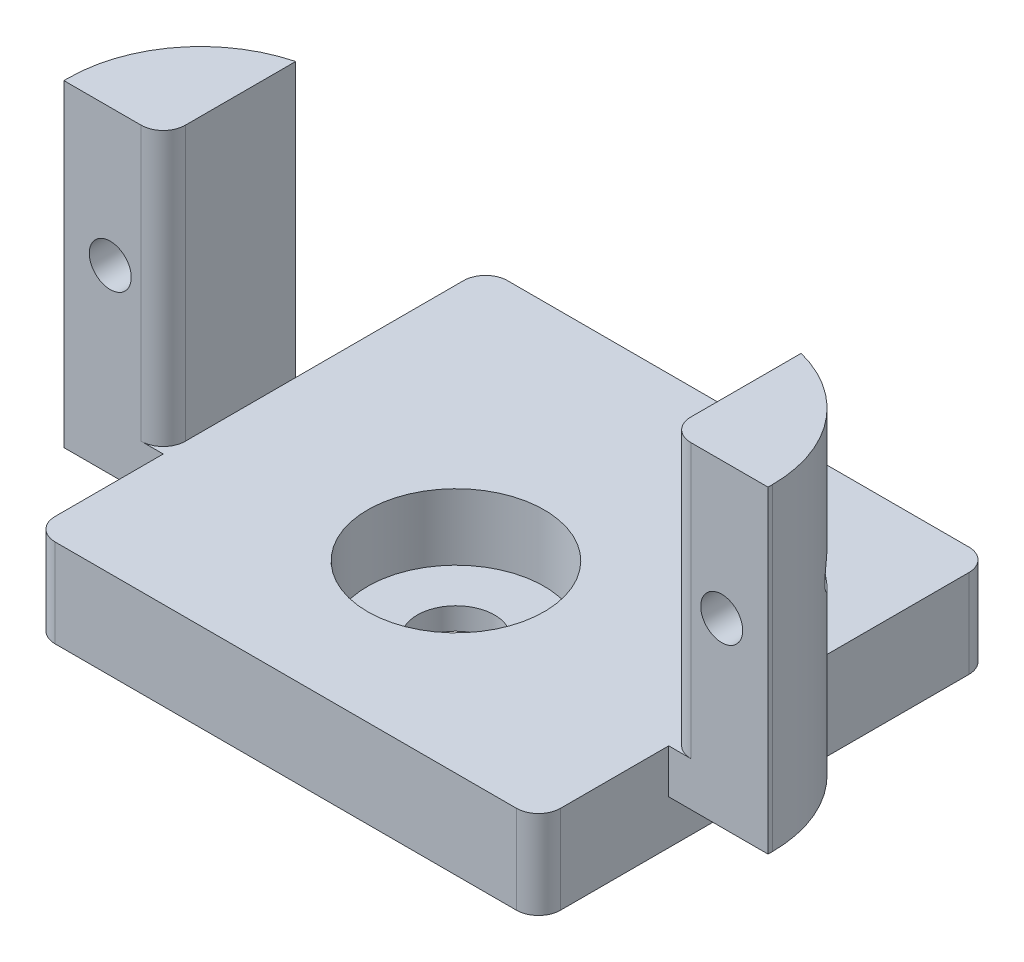
ISO-10303-21;
HEADER;
FILE_DESCRIPTION(('STEP AP214'),'2;1');
FILE_NAME('part.step','',(''),(''),'','','');
FILE_SCHEMA(('AUTOMOTIVE_DESIGN { 1 0 10303 214 1 1 1 1 }'));
ENDSEC;
DATA;
#1=APPLICATION_CONTEXT('core data for automotive mechanical design processes');
#2=APPLICATION_PROTOCOL_DEFINITION('international standard','automotive_design',2000,#1);
#3=PRODUCT_CONTEXT('',#1,'mechanical');
#4=PRODUCT('Part','Part','',(#3));
#5=PRODUCT_RELATED_PRODUCT_CATEGORY('part','',(#4));
#6=PRODUCT_DEFINITION_FORMATION('','',#4);
#7=PRODUCT_DEFINITION_CONTEXT('part definition',#1,'design');
#8=PRODUCT_DEFINITION('design','',#6,#7);
#9=PRODUCT_DEFINITION_SHAPE('','',#8);
#10=(LENGTH_UNIT() NAMED_UNIT(*) SI_UNIT(.MILLI.,.METRE.));
#11=(NAMED_UNIT(*) PLANE_ANGLE_UNIT() SI_UNIT($,.RADIAN.));
#12=(NAMED_UNIT(*) SI_UNIT($,.STERADIAN.) SOLID_ANGLE_UNIT());
#13=UNCERTAINTY_MEASURE_WITH_UNIT(LENGTH_MEASURE(1.E-05),#10,'distance_accuracy_value','');
#14=(GEOMETRIC_REPRESENTATION_CONTEXT(3) GLOBAL_UNCERTAINTY_ASSIGNED_CONTEXT((#13)) GLOBAL_UNIT_ASSIGNED_CONTEXT((#10,
#11,#12)) REPRESENTATION_CONTEXT('',''));
#15=CARTESIAN_POINT('',(0.,0.,0.));
#16=DIRECTION('',(0.,0.,1.));
#17=DIRECTION('',(1.,0.,0.));
#18=AXIS2_PLACEMENT_3D('',#15,#16,#17);
#19=CARTESIAN_POINT('',(0.,0.,0.));
#20=DIRECTION('',(0.,1.,0.));
#21=DIRECTION('',(0.,0.,1.));
#22=AXIS2_PLACEMENT_3D('',#19,#20,#21);
#23=PLANE('',#22);
#24=DIRECTION('',(0.,0.,1.));
#25=VECTOR('',#24,1.);
#26=CARTESIAN_POINT('',(-15.95,0.,4.1));
#27=LINE('',#26,#25);
#28=CARTESIAN_POINT('',(-15.95,0.,3.90947501931113));
#29=VERTEX_POINT('',#28);
#30=CARTESIAN_POINT('',(-15.95,0.,4.1));
#31=VERTEX_POINT('',#30);
#32=EDGE_CURVE('E185',#29,#31,#27,.T.);
#33=ORIENTED_EDGE('',*,*,#32,.F.);
#34=CARTESIAN_POINT('',(-9.95,0.,3.90947501931113));
#35=DIRECTION('',(0.,1.,0.));
#36=DIRECTION('',(0.,0.,1.));
#37=AXIS2_PLACEMENT_3D('',#34,#35,#36);
#38=CIRCLE('',#37,6.);
#39=CARTESIAN_POINT('',(-11.45,0.,-1.9));
#40=VERTEX_POINT('',#39);
#41=EDGE_CURVE('E48',#29,#40,#38,.F.);
#42=ORIENTED_EDGE('',*,*,#41,.T.);
#43=DIRECTION('',(0.,0.,1.));
#44=VECTOR('',#43,1.);
#45=CARTESIAN_POINT('',(-11.45,0.,-10.5));
#46=LINE('',#45,#44);
#47=CARTESIAN_POINT('',(-11.45,0.,4.1));
#48=VERTEX_POINT('',#47);
#49=EDGE_CURVE('E183',#40,#48,#46,.T.);
#50=ORIENTED_EDGE('',*,*,#49,.T.);
#51=DIRECTION('',(1.,0.,0.));
#52=VECTOR('',#51,1.);
#53=CARTESIAN_POINT('',(-11.45,0.,4.1));
#54=LINE('',#53,#52);
#55=EDGE_CURVE('E228',#31,#48,#54,.T.);
#56=ORIENTED_EDGE('',*,*,#55,.F.);
#57=EDGE_LOOP('',(#33,#42,#50,#56));
#58=FACE_BOUND('',#57,.T.);
#59=ADVANCED_FACE('F34',(#58),#23,.F.);
#60=CARTESIAN_POINT('',(11.45,2.,-10.5));
#61=DIRECTION('',(0.,0.,1.));
#62=DIRECTION('',(1.,0.,0.));
#63=AXIS2_PLACEMENT_3D('',#60,#61,#62);
#64=PLANE('',#63);
#65=DIRECTION('',(-1.,0.,0.));
#66=VECTOR('',#65,1.);
#67=CARTESIAN_POINT('',(11.45,2.,-10.5));
#68=LINE('',#67,#66);
#69=CARTESIAN_POINT('',(10.45,2.,-10.5));
#70=VERTEX_POINT('',#69);
#71=CARTESIAN_POINT('',(-10.45,2.,-10.5));
#72=VERTEX_POINT('',#71);
#73=EDGE_CURVE('E215',#70,#72,#68,.T.);
#74=ORIENTED_EDGE('',*,*,#73,.F.);
#75=DIRECTION('',(0.,-1.,0.));
#76=VECTOR('',#75,1.);
#77=CARTESIAN_POINT('',(10.45,2.,-10.5));
#78=LINE('',#77,#76);
#79=CARTESIAN_POINT('',(10.45,-2.,-10.5));
#80=VERTEX_POINT('',#79);
#81=EDGE_CURVE('E700',#70,#80,#78,.T.);
#82=ORIENTED_EDGE('',*,*,#81,.T.);
#83=DIRECTION('',(-1.,0.,0.));
#84=VECTOR('',#83,1.);
#85=CARTESIAN_POINT('',(11.45,-2.,-10.5));
#86=LINE('',#85,#84);
#87=CARTESIAN_POINT('',(-10.45,-2.,-10.5));
#88=VERTEX_POINT('',#87);
#89=EDGE_CURVE('E270',#80,#88,#86,.T.);
#90=ORIENTED_EDGE('',*,*,#89,.T.);
#91=DIRECTION('',(0.,-1.,0.));
#92=VECTOR('',#91,1.);
#93=CARTESIAN_POINT('',(-10.45,2.,-10.5));
#94=LINE('',#93,#92);
#95=EDGE_CURVE('E199',#88,#72,#94,.F.);
#96=ORIENTED_EDGE('',*,*,#95,.T.);
#97=EDGE_LOOP('',(#74,#82,#90,#96));
#98=FACE_BOUND('',#97,.T.);
#99=ADVANCED_FACE('F359',(#98),#64,.F.);
#100=CARTESIAN_POINT('',(-11.45,2.,-10.5));
#101=DIRECTION('',(1.,0.,0.));
#102=DIRECTION('',(0.,0.,-1.));
#103=AXIS2_PLACEMENT_3D('',#100,#101,#102);
#104=PLANE('',#103);
#105=DIRECTION('',(0.,0.,1.));
#106=VECTOR('',#105,1.);
#107=CARTESIAN_POINT('',(-11.45,-2.,-10.5));
#108=LINE('',#107,#106);
#109=CARTESIAN_POINT('',(-11.45,-2.,-9.5));
#110=VERTEX_POINT('',#109);
#111=CARTESIAN_POINT('',(-11.45,-2.,9.));
#112=VERTEX_POINT('',#111);
#113=EDGE_CURVE('E268',#110,#112,#108,.T.);
#114=ORIENTED_EDGE('',*,*,#113,.T.);
#115=DIRECTION('',(0.,1.,0.));
#116=VECTOR('',#115,1.);
#117=CARTESIAN_POINT('',(-11.45,2.,9.));
#118=LINE('',#117,#116);
#119=CARTESIAN_POINT('',(-11.45,2.,9.));
#120=VERTEX_POINT('',#119);
#121=EDGE_CURVE('E305',#112,#120,#118,.T.);
#122=ORIENTED_EDGE('',*,*,#121,.T.);
#123=DIRECTION('',(0.,0.,1.));
#124=VECTOR('',#123,1.);
#125=CARTESIAN_POINT('',(-11.45,2.,-10.5));
#126=LINE('',#125,#124);
#127=CARTESIAN_POINT('',(-11.45,2.,4.1));
#128=VERTEX_POINT('',#127);
#129=EDGE_CURVE('E218',#128,#120,#126,.T.);
#130=ORIENTED_EDGE('',*,*,#129,.F.);
#131=DIRECTION('',(0.,-1.,0.));
#132=VECTOR('',#131,1.);
#133=CARTESIAN_POINT('',(-11.45,14.4,4.1));
#134=LINE('',#133,#132);
#135=EDGE_CURVE('E198',#128,#48,#134,.T.);
#136=ORIENTED_EDGE('',*,*,#135,.T.);
#137=ORIENTED_EDGE('',*,*,#49,.F.);
#138=DIRECTION('',(0.,-1.,0.));
#139=VECTOR('',#138,1.);
#140=CARTESIAN_POINT('',(-11.45,14.4,-1.9));
#141=LINE('',#140,#139);
#142=CARTESIAN_POINT('',(-11.45,2.,-1.9));
#143=VERTEX_POINT('',#142);
#144=EDGE_CURVE('E194',#143,#40,#141,.T.);
#145=ORIENTED_EDGE('',*,*,#144,.F.);
#146=CARTESIAN_POINT('',(-11.45,2.,-9.5));
#147=VERTEX_POINT('',#146);
#148=EDGE_CURVE('E642',#147,#143,#126,.T.);
#149=ORIENTED_EDGE('',*,*,#148,.F.);
#150=DIRECTION('',(0.,-1.,0.));
#151=VECTOR('',#150,1.);
#152=CARTESIAN_POINT('',(-11.45,2.,-9.5));
#153=LINE('',#152,#151);
#154=EDGE_CURVE('E690',#147,#110,#153,.T.);
#155=ORIENTED_EDGE('',*,*,#154,.T.);
#156=EDGE_LOOP('',(#114,#122,#130,#136,#137,#145,#149,#155));
#157=FACE_BOUND('',#156,.T.);
#158=ADVANCED_FACE('F192',(#157),#104,.F.);
#159=CARTESIAN_POINT('',(11.45,2.,-10.5));
#160=DIRECTION('',(-1.,0.,0.));
#161=DIRECTION('',(0.,0.,1.));
#162=AXIS2_PLACEMENT_3D('',#159,#160,#161);
#163=PLANE('',#162);
#164=DIRECTION('',(0.,0.,-1.));
#165=VECTOR('',#164,1.);
#166=CARTESIAN_POINT('',(11.45,2.,-10.5));
#167=LINE('',#166,#165);
#168=CARTESIAN_POINT('',(11.45,2.,9.));
#169=VERTEX_POINT('',#168);
#170=CARTESIAN_POINT('',(11.45,2.,4.1));
#171=VERTEX_POINT('',#170);
#172=EDGE_CURVE('E211',#169,#171,#167,.T.);
#173=ORIENTED_EDGE('',*,*,#172,.F.);
#174=DIRECTION('',(0.,1.,0.));
#175=VECTOR('',#174,1.);
#176=CARTESIAN_POINT('',(11.45,2.,9.));
#177=LINE('',#176,#175);
#178=CARTESIAN_POINT('',(11.45,-2.,9.));
#179=VERTEX_POINT('',#178);
#180=EDGE_CURVE('E306',#169,#179,#177,.F.);
#181=ORIENTED_EDGE('',*,*,#180,.T.);
#182=DIRECTION('',(0.,0.,-1.));
#183=VECTOR('',#182,1.);
#184=CARTESIAN_POINT('',(11.45,-2.,-10.5));
#185=LINE('',#184,#183);
#186=CARTESIAN_POINT('',(11.45,-2.,-9.5));
#187=VERTEX_POINT('',#186);
#188=EDGE_CURVE('E261',#179,#187,#185,.T.);
#189=ORIENTED_EDGE('',*,*,#188,.T.);
#190=DIRECTION('',(0.,-1.,0.));
#191=VECTOR('',#190,1.);
#192=CARTESIAN_POINT('',(11.45,2.,-9.5));
#193=LINE('',#192,#191);
#194=CARTESIAN_POINT('',(11.45,2.,-9.5));
#195=VERTEX_POINT('',#194);
#196=EDGE_CURVE('E678',#187,#195,#193,.F.);
#197=ORIENTED_EDGE('',*,*,#196,.T.);
#198=CARTESIAN_POINT('',(11.45,2.,-1.9));
#199=VERTEX_POINT('',#198);
#200=EDGE_CURVE('E645',#199,#195,#167,.T.);
#201=ORIENTED_EDGE('',*,*,#200,.F.);
#202=DIRECTION('',(0.,-1.,0.));
#203=VECTOR('',#202,1.);
#204=CARTESIAN_POINT('',(11.45,14.4,-1.9));
#205=LINE('',#204,#203);
#206=CARTESIAN_POINT('',(11.45,0.,-1.9));
#207=VERTEX_POINT('',#206);
#208=EDGE_CURVE('E205',#199,#207,#205,.T.);
#209=ORIENTED_EDGE('',*,*,#208,.T.);
#210=DIRECTION('',(0.,0.,-1.));
#211=VECTOR('',#210,1.);
#212=CARTESIAN_POINT('',(11.45,0.,-10.5));
#213=LINE('',#212,#211);
#214=CARTESIAN_POINT('',(11.45,0.,4.1));
#215=VERTEX_POINT('',#214);
#216=EDGE_CURVE('E200',#215,#207,#213,.T.);
#217=ORIENTED_EDGE('',*,*,#216,.F.);
#218=DIRECTION('',(0.,-1.,0.));
#219=VECTOR('',#218,1.);
#220=CARTESIAN_POINT('',(11.45,14.4,4.1));
#221=LINE('',#220,#219);
#222=EDGE_CURVE('E208',#171,#215,#221,.T.);
#223=ORIENTED_EDGE('',*,*,#222,.F.);
#224=EDGE_LOOP('',(#173,#181,#189,#197,#201,#209,#217,#223));
#225=FACE_BOUND('',#224,.T.);
#226=ADVANCED_FACE('F365',(#225),#163,.F.);
#227=CARTESIAN_POINT('',(0.,2.,0.));
#228=DIRECTION('',(0.,1.,0.));
#229=DIRECTION('',(0.,0.,1.));
#230=AXIS2_PLACEMENT_3D('',#227,#228,#229);
#231=PLANE('',#230);
#232=DIRECTION('',(-1.,0.,0.));
#233=VECTOR('',#232,1.);
#234=CARTESIAN_POINT('',(-11.4506036576507,2.,10.));
#235=LINE('',#234,#233);
#236=CARTESIAN_POINT('',(10.45,2.,10.));
#237=VERTEX_POINT('',#236);
#238=CARTESIAN_POINT('',(-10.45,2.,10.));
#239=VERTEX_POINT('',#238);
#240=EDGE_CURVE('E283',#237,#239,#235,.T.);
#241=ORIENTED_EDGE('',*,*,#240,.F.);
#242=CARTESIAN_POINT('',(10.45,2.,9.));
#243=DIRECTION('',(0.,1.,0.));
#244=DIRECTION('',(0.,0.,1.));
#245=AXIS2_PLACEMENT_3D('',#242,#243,#244);
#246=CIRCLE('',#245,1.);
#247=EDGE_CURVE('E309',#237,#169,#246,.T.);
#248=ORIENTED_EDGE('',*,*,#247,.T.);
#249=ORIENTED_EDGE('',*,*,#172,.T.);
#250=DIRECTION('',(-1.,0.,0.));
#251=VECTOR('',#250,1.);
#252=CARTESIAN_POINT('',(0.,2.,4.1));
#253=LINE('',#252,#251);
#254=CARTESIAN_POINT('',(12.45,2.,4.1));
#255=VERTEX_POINT('',#254);
#256=EDGE_CURVE('E237',#255,#171,#253,.T.);
#257=ORIENTED_EDGE('',*,*,#256,.F.);
#258=CARTESIAN_POINT('',(12.45,2.,3.1));
#259=DIRECTION('',(0.,1.,0.));
#260=DIRECTION('',(0.,0.,1.));
#261=AXIS2_PLACEMENT_3D('',#258,#259,#260);
#262=CIRCLE('',#261,1.);
#263=CARTESIAN_POINT('',(11.45,2.,3.1));
#264=VERTEX_POINT('',#263);
#265=EDGE_CURVE('E707',#255,#264,#262,.F.);
#266=ORIENTED_EDGE('',*,*,#265,.T.);
#267=EDGE_CURVE('E648',#264,#199,#167,.T.);
#268=ORIENTED_EDGE('',*,*,#267,.T.);
#269=ORIENTED_EDGE('',*,*,#200,.T.);
#270=CARTESIAN_POINT('',(10.45,2.,-9.5));
#271=DIRECTION('',(0.,1.,0.));
#272=DIRECTION('',(0.,0.,1.));
#273=AXIS2_PLACEMENT_3D('',#270,#271,#272);
#274=CIRCLE('',#273,1.);
#275=EDGE_CURVE('E683',#195,#70,#274,.T.);
#276=ORIENTED_EDGE('',*,*,#275,.T.);
#277=ORIENTED_EDGE('',*,*,#73,.T.);
#278=CARTESIAN_POINT('',(-10.45,2.,-9.5));
#279=DIRECTION('',(0.,1.,0.));
#280=DIRECTION('',(0.,0.,1.));
#281=AXIS2_PLACEMENT_3D('',#278,#279,#280);
#282=CIRCLE('',#281,1.);
#283=EDGE_CURVE('E680',#72,#147,#282,.T.);
#284=ORIENTED_EDGE('',*,*,#283,.T.);
#285=ORIENTED_EDGE('',*,*,#148,.T.);
#286=CARTESIAN_POINT('',(-11.45,2.,3.1));
#287=VERTEX_POINT('',#286);
#288=EDGE_CURVE('E640',#143,#287,#126,.T.);
#289=ORIENTED_EDGE('',*,*,#288,.T.);
#290=CARTESIAN_POINT('',(-12.45,2.,3.1));
#291=DIRECTION('',(0.,1.,0.));
#292=DIRECTION('',(0.,0.,1.));
#293=AXIS2_PLACEMENT_3D('',#290,#291,#292);
#294=CIRCLE('',#293,1.);
#295=CARTESIAN_POINT('',(-12.45,2.,4.1));
#296=VERTEX_POINT('',#295);
#297=EDGE_CURVE('E265',#287,#296,#294,.F.);
#298=ORIENTED_EDGE('',*,*,#297,.T.);
#299=DIRECTION('',(-1.,0.,0.));
#300=VECTOR('',#299,1.);
#301=CARTESIAN_POINT('',(0.,2.,4.1));
#302=LINE('',#301,#300);
#303=EDGE_CURVE('E637',#128,#296,#302,.T.);
#304=ORIENTED_EDGE('',*,*,#303,.F.);
#305=ORIENTED_EDGE('',*,*,#129,.T.);
#306=CARTESIAN_POINT('',(-10.45,2.,9.));
#307=DIRECTION('',(0.,1.,0.));
#308=DIRECTION('',(0.,0.,1.));
#309=AXIS2_PLACEMENT_3D('',#306,#307,#308);
#310=CIRCLE('',#309,1.);
#311=EDGE_CURVE('E696',#120,#239,#310,.T.);
#312=ORIENTED_EDGE('',*,*,#311,.T.);
#313=EDGE_LOOP('',(#241,#248,#249,#257,#266,#268,#269,#276,#277,#284,#285,#289,#298,#304,#305,#312));
#314=FACE_BOUND('',#313,.T.);
#315=CARTESIAN_POINT('',(-0.630000000000001,2.,1.66));
#316=DIRECTION('',(0.,1.,0.));
#317=DIRECTION('',(0.,0.,1.));
#318=AXIS2_PLACEMENT_3D('',#315,#316,#317);
#319=CIRCLE('',#318,4.);
#320=CARTESIAN_POINT('',(-0.630000000000001,2.,5.66));
#321=VERTEX_POINT('',#320);
#322=EDGE_CURVE('E248',#321,#321,#319,.T.);
#323=ORIENTED_EDGE('',*,*,#322,.F.);
#324=EDGE_LOOP('',(#323));
#325=FACE_BOUND('',#324,.T.);
#326=ADVANCED_FACE('F368',(#314,#325),#231,.T.);
#327=ORIENTED_EDGE('',*,*,#216,.T.);
#328=CARTESIAN_POINT('',(9.95,0.,3.90947501931112));
#329=DIRECTION('',(0.,1.,0.));
#330=DIRECTION('',(0.,0.,1.));
#331=AXIS2_PLACEMENT_3D('',#328,#329,#330);
#332=CIRCLE('',#331,6.);
#333=CARTESIAN_POINT('',(15.95,0.,3.90947501931112));
#334=VERTEX_POINT('',#333);
#335=EDGE_CURVE('E314',#207,#334,#332,.F.);
#336=ORIENTED_EDGE('',*,*,#335,.T.);
#337=DIRECTION('',(0.,0.,-1.));
#338=VECTOR('',#337,1.);
#339=CARTESIAN_POINT('',(15.95,0.,4.1));
#340=LINE('',#339,#338);
#341=CARTESIAN_POINT('',(15.95,0.,4.1));
#342=VERTEX_POINT('',#341);
#343=EDGE_CURVE('E242',#342,#334,#340,.T.);
#344=ORIENTED_EDGE('',*,*,#343,.F.);
#345=DIRECTION('',(1.,0.,0.));
#346=VECTOR('',#345,1.);
#347=CARTESIAN_POINT('',(11.45,0.,4.1));
#348=LINE('',#347,#346);
#349=EDGE_CURVE('E246',#215,#342,#348,.T.);
#350=ORIENTED_EDGE('',*,*,#349,.F.);
#351=EDGE_LOOP('',(#327,#336,#344,#350));
#352=FACE_BOUND('',#351,.T.);
#353=ADVANCED_FACE('F370',(#352),#23,.F.);
#354=CARTESIAN_POINT('',(-11.45,14.4,-1.9));
#355=DIRECTION('',(-1.,0.,0.));
#356=DIRECTION('',(0.,0.,1.));
#357=AXIS2_PLACEMENT_3D('',#354,#355,#356);
#358=PLANE('',#357);
#359=DIRECTION('',(0.,0.,-1.));
#360=VECTOR('',#359,1.);
#361=CARTESIAN_POINT('',(-11.45,14.4,-1.9));
#362=LINE('',#361,#360);
#363=CARTESIAN_POINT('',(-11.45,14.4,3.1));
#364=VERTEX_POINT('',#363);
#365=CARTESIAN_POINT('',(-11.45,14.4,-1.9));
#366=VERTEX_POINT('',#365);
#367=EDGE_CURVE('E230',#364,#366,#362,.T.);
#368=ORIENTED_EDGE('',*,*,#367,.F.);
#369=DIRECTION('',(0.,-1.,0.));
#370=VECTOR('',#369,1.);
#371=CARTESIAN_POINT('',(-11.45,14.4,3.1));
#372=LINE('',#371,#370);
#373=EDGE_CURVE('E714',#364,#287,#372,.T.);
#374=ORIENTED_EDGE('',*,*,#373,.T.);
#375=ORIENTED_EDGE('',*,*,#288,.F.);
#376=EDGE_CURVE('E204',#366,#143,#141,.T.);
#377=ORIENTED_EDGE('',*,*,#376,.F.);
#378=EDGE_LOOP('',(#368,#374,#375,#377));
#379=FACE_BOUND('',#378,.T.);
#380=ADVANCED_FACE('F373',(#379),#358,.F.);
#381=CARTESIAN_POINT('',(-15.95,14.4,4.1));
#382=DIRECTION('',(1.,0.,0.));
#383=DIRECTION('',(0.,0.,-1.));
#384=AXIS2_PLACEMENT_3D('',#381,#382,#383);
#385=PLANE('',#384);
#386=DIRECTION('',(0.,0.,1.));
#387=VECTOR('',#386,1.);
#388=CARTESIAN_POINT('',(-15.95,14.4,4.1));
#389=LINE('',#388,#387);
#390=CARTESIAN_POINT('',(-15.95,14.4,3.90947501931113));
#391=VERTEX_POINT('',#390);
#392=CARTESIAN_POINT('',(-15.95,14.4,4.1));
#393=VERTEX_POINT('',#392);
#394=EDGE_CURVE('E225',#391,#393,#389,.T.);
#395=ORIENTED_EDGE('',*,*,#394,.F.);
#396=DIRECTION('',(0.,1.,0.));
#397=VECTOR('',#396,1.);
#398=CARTESIAN_POINT('',(-15.95,14.4,3.90947501931113));
#399=LINE('',#398,#397);
#400=EDGE_CURVE('E186',#391,#29,#399,.F.);
#401=ORIENTED_EDGE('',*,*,#400,.T.);
#402=ORIENTED_EDGE('',*,*,#32,.T.);
#403=DIRECTION('',(0.,-1.,0.));
#404=VECTOR('',#403,1.);
#405=CARTESIAN_POINT('',(-15.95,14.4,4.1));
#406=LINE('',#405,#404);
#407=EDGE_CURVE('E216',#393,#31,#406,.T.);
#408=ORIENTED_EDGE('',*,*,#407,.F.);
#409=EDGE_LOOP('',(#395,#401,#402,#408));
#410=FACE_BOUND('',#409,.T.);
#411=ADVANCED_FACE('F380',(#410),#385,.F.);
#412=CARTESIAN_POINT('',(-11.45,14.4,4.1));
#413=DIRECTION('',(0.,0.,-1.));
#414=DIRECTION('',(-1.,0.,0.));
#415=AXIS2_PLACEMENT_3D('',#412,#413,#414);
#416=PLANE('',#415);
#417=CARTESIAN_POINT('',(-13.85,8.2,4.1));
#418=DIRECTION('',(0.,0.,1.));
#419=DIRECTION('',(1.,0.,0.));
#420=AXIS2_PLACEMENT_3D('',#417,#418,#419);
#421=CIRCLE('',#420,0.949999999999999);
#422=CARTESIAN_POINT('',(-12.9,8.2,4.1));
#423=VERTEX_POINT('',#422);
#424=EDGE_CURVE('E260',#423,#423,#421,.T.);
#425=ORIENTED_EDGE('',*,*,#424,.F.);
#426=EDGE_LOOP('',(#425));
#427=FACE_BOUND('',#426,.T.);
#428=ORIENTED_EDGE('',*,*,#135,.F.);
#429=ORIENTED_EDGE('',*,*,#303,.T.);
#430=DIRECTION('',(0.,-1.,0.));
#431=VECTOR('',#430,1.);
#432=CARTESIAN_POINT('',(-12.45,14.4,4.1));
#433=LINE('',#432,#431);
#434=CARTESIAN_POINT('',(-12.45,14.4,4.1));
#435=VERTEX_POINT('',#434);
#436=EDGE_CURVE('E712',#296,#435,#433,.F.);
#437=ORIENTED_EDGE('',*,*,#436,.T.);
#438=DIRECTION('',(1.,0.,0.));
#439=VECTOR('',#438,1.);
#440=CARTESIAN_POINT('',(-11.45,14.4,4.1));
#441=LINE('',#440,#439);
#442=EDGE_CURVE('E220',#393,#435,#441,.T.);
#443=ORIENTED_EDGE('',*,*,#442,.F.);
#444=ORIENTED_EDGE('',*,*,#407,.T.);
#445=ORIENTED_EDGE('',*,*,#55,.T.);
#446=EDGE_LOOP('',(#428,#429,#437,#443,#444,#445));
#447=FACE_BOUND('',#446,.T.);
#448=ADVANCED_FACE('F384',(#427,#447),#416,.F.);
#449=CARTESIAN_POINT('',(0.,14.4,0.));
#450=DIRECTION('',(0.,-1.,0.));
#451=DIRECTION('',(0.,0.,-1.));
#452=AXIS2_PLACEMENT_3D('',#449,#450,#451);
#453=PLANE('',#452);
#454=ORIENTED_EDGE('',*,*,#367,.T.);
#455=CARTESIAN_POINT('',(-9.95,14.4,3.90947501931113));
#456=DIRECTION('',(0.,-1.,0.));
#457=DIRECTION('',(0.,0.,-1.));
#458=AXIS2_PLACEMENT_3D('',#455,#456,#457);
#459=CIRCLE('',#458,6.);
#460=EDGE_CURVE('E11',#366,#391,#459,.F.);
#461=ORIENTED_EDGE('',*,*,#460,.T.);
#462=ORIENTED_EDGE('',*,*,#394,.T.);
#463=ORIENTED_EDGE('',*,*,#442,.T.);
#464=CARTESIAN_POINT('',(-12.45,14.4,3.1));
#465=DIRECTION('',(0.,-1.,0.));
#466=DIRECTION('',(0.,0.,-1.));
#467=AXIS2_PLACEMENT_3D('',#464,#465,#466);
#468=CIRCLE('',#467,1.);
#469=EDGE_CURVE('E709',#435,#364,#468,.F.);
#470=ORIENTED_EDGE('',*,*,#469,.T.);
#471=EDGE_LOOP('',(#454,#461,#462,#463,#470));
#472=FACE_BOUND('',#471,.T.);
#473=ADVANCED_FACE('F388',(#472),#453,.F.);
#474=CARTESIAN_POINT('',(11.45,14.4,-1.9));
#475=DIRECTION('',(1.,0.,0.));
#476=DIRECTION('',(0.,0.,-1.));
#477=AXIS2_PLACEMENT_3D('',#474,#475,#476);
#478=PLANE('',#477);
#479=ORIENTED_EDGE('',*,*,#267,.F.);
#480=DIRECTION('',(0.,-1.,0.));
#481=VECTOR('',#480,1.);
#482=CARTESIAN_POINT('',(11.45,14.4,3.1));
#483=LINE('',#482,#481);
#484=CARTESIAN_POINT('',(11.45,14.4,3.1));
#485=VERTEX_POINT('',#484);
#486=EDGE_CURVE('E719',#264,#485,#483,.F.);
#487=ORIENTED_EDGE('',*,*,#486,.T.);
#488=DIRECTION('',(0.,0.,1.));
#489=VECTOR('',#488,1.);
#490=CARTESIAN_POINT('',(11.45,14.4,-1.9));
#491=LINE('',#490,#489);
#492=CARTESIAN_POINT('',(11.45,14.4,-1.9));
#493=VERTEX_POINT('',#492);
#494=EDGE_CURVE('E245',#493,#485,#491,.T.);
#495=ORIENTED_EDGE('',*,*,#494,.F.);
#496=EDGE_CURVE('E210',#493,#199,#205,.T.);
#497=ORIENTED_EDGE('',*,*,#496,.T.);
#498=EDGE_LOOP('',(#479,#487,#495,#497));
#499=FACE_BOUND('',#498,.T.);
#500=ADVANCED_FACE('F392',(#499),#478,.F.);
#501=CARTESIAN_POINT('',(11.45,14.4,4.1));
#502=DIRECTION('',(0.,0.,-1.));
#503=DIRECTION('',(-1.,0.,0.));
#504=AXIS2_PLACEMENT_3D('',#501,#502,#503);
#505=PLANE('',#504);
#506=CARTESIAN_POINT('',(13.85,8.2,4.1));
#507=DIRECTION('',(0.,0.,1.));
#508=DIRECTION('',(1.,0.,0.));
#509=AXIS2_PLACEMENT_3D('',#506,#507,#508);
#510=CIRCLE('',#509,0.950000000000001);
#511=CARTESIAN_POINT('',(14.8,8.2,4.1));
#512=VERTEX_POINT('',#511);
#513=EDGE_CURVE('E257',#512,#512,#510,.T.);
#514=ORIENTED_EDGE('',*,*,#513,.F.);
#515=EDGE_LOOP('',(#514));
#516=FACE_BOUND('',#515,.T.);
#517=DIRECTION('',(1.,0.,0.));
#518=VECTOR('',#517,1.);
#519=CARTESIAN_POINT('',(11.45,14.4,4.1));
#520=LINE('',#519,#518);
#521=CARTESIAN_POINT('',(12.45,14.4,4.1));
#522=VERTEX_POINT('',#521);
#523=CARTESIAN_POINT('',(15.95,14.4,4.1));
#524=VERTEX_POINT('',#523);
#525=EDGE_CURVE('E251',#522,#524,#520,.T.);
#526=ORIENTED_EDGE('',*,*,#525,.F.);
#527=DIRECTION('',(0.,-1.,0.));
#528=VECTOR('',#527,1.);
#529=CARTESIAN_POINT('',(12.45,14.4,4.1));
#530=LINE('',#529,#528);
#531=EDGE_CURVE('E665',#522,#255,#530,.T.);
#532=ORIENTED_EDGE('',*,*,#531,.T.);
#533=ORIENTED_EDGE('',*,*,#256,.T.);
#534=ORIENTED_EDGE('',*,*,#222,.T.);
#535=ORIENTED_EDGE('',*,*,#349,.T.);
#536=DIRECTION('',(0.,-1.,0.));
#537=VECTOR('',#536,1.);
#538=CARTESIAN_POINT('',(15.95,14.4,4.1));
#539=LINE('',#538,#537);
#540=EDGE_CURVE('E231',#524,#342,#539,.T.);
#541=ORIENTED_EDGE('',*,*,#540,.F.);
#542=EDGE_LOOP('',(#526,#532,#533,#534,#535,#541));
#543=FACE_BOUND('',#542,.T.);
#544=ADVANCED_FACE('F395',(#516,#543),#505,.F.);
#545=CARTESIAN_POINT('',(15.95,14.4,4.1));
#546=DIRECTION('',(-1.,0.,0.));
#547=DIRECTION('',(0.,0.,1.));
#548=AXIS2_PLACEMENT_3D('',#545,#546,#547);
#549=PLANE('',#548);
#550=ORIENTED_EDGE('',*,*,#343,.T.);
#551=DIRECTION('',(0.,1.,0.));
#552=VECTOR('',#551,1.);
#553=CARTESIAN_POINT('',(15.95,14.4,3.90947501931112));
#554=LINE('',#553,#552);
#555=CARTESIAN_POINT('',(15.95,14.4,3.90947501931112));
#556=VERTEX_POINT('',#555);
#557=EDGE_CURVE('E316',#334,#556,#554,.T.);
#558=ORIENTED_EDGE('',*,*,#557,.T.);
#559=DIRECTION('',(0.,0.,-1.));
#560=VECTOR('',#559,1.);
#561=CARTESIAN_POINT('',(15.95,14.4,4.1));
#562=LINE('',#561,#560);
#563=EDGE_CURVE('E241',#524,#556,#562,.T.);
#564=ORIENTED_EDGE('',*,*,#563,.F.);
#565=ORIENTED_EDGE('',*,*,#540,.T.);
#566=EDGE_LOOP('',(#550,#558,#564,#565));
#567=FACE_BOUND('',#566,.T.);
#568=ADVANCED_FACE('F399',(#567),#549,.F.);
#569=CARTESIAN_POINT('',(0.,14.4,0.));
#570=DIRECTION('',(0.,1.,0.));
#571=DIRECTION('',(0.,0.,1.));
#572=AXIS2_PLACEMENT_3D('',#569,#570,#571);
#573=PLANE('',#572);
#574=ORIENTED_EDGE('',*,*,#563,.T.);
#575=CARTESIAN_POINT('',(9.95,14.4,3.90947501931112));
#576=DIRECTION('',(0.,1.,0.));
#577=DIRECTION('',(0.,0.,1.));
#578=AXIS2_PLACEMENT_3D('',#575,#576,#577);
#579=CIRCLE('',#578,6.);
#580=EDGE_CURVE('E318',#556,#493,#579,.T.);
#581=ORIENTED_EDGE('',*,*,#580,.T.);
#582=ORIENTED_EDGE('',*,*,#494,.T.);
#583=CARTESIAN_POINT('',(12.45,14.4,3.1));
#584=DIRECTION('',(0.,1.,0.));
#585=DIRECTION('',(0.,0.,1.));
#586=AXIS2_PLACEMENT_3D('',#583,#584,#585);
#587=CIRCLE('',#586,1.);
#588=EDGE_CURVE('E717',#485,#522,#587,.T.);
#589=ORIENTED_EDGE('',*,*,#588,.T.);
#590=ORIENTED_EDGE('',*,*,#525,.T.);
#591=EDGE_LOOP('',(#574,#581,#582,#589,#590));
#592=FACE_BOUND('',#591,.T.);
#593=ADVANCED_FACE('F357',(#592),#573,.T.);
#594=CARTESIAN_POINT('',(12.45,14.4,3.1));
#595=DIRECTION('',(0.,-1.,0.));
#596=DIRECTION('',(0.,0.,-1.));
#597=AXIS2_PLACEMENT_3D('',#594,#595,#596);
#598=CYLINDRICAL_SURFACE('',#597,1.);
#599=ORIENTED_EDGE('',*,*,#588,.F.);
#600=ORIENTED_EDGE('',*,*,#486,.F.);
#601=ORIENTED_EDGE('',*,*,#265,.F.);
#602=ORIENTED_EDGE('',*,*,#531,.F.);
#603=EDGE_LOOP('',(#599,#600,#601,#602));
#604=FACE_BOUND('',#603,.T.);
#605=ADVANCED_FACE('F353',(#604),#598,.T.);
#606=CARTESIAN_POINT('',(-12.45,14.4,3.1));
#607=DIRECTION('',(0.,-1.,0.));
#608=DIRECTION('',(0.,0.,-1.));
#609=AXIS2_PLACEMENT_3D('',#606,#607,#608);
#610=CYLINDRICAL_SURFACE('',#609,1.);
#611=ORIENTED_EDGE('',*,*,#469,.F.);
#612=ORIENTED_EDGE('',*,*,#436,.F.);
#613=ORIENTED_EDGE('',*,*,#297,.F.);
#614=ORIENTED_EDGE('',*,*,#373,.F.);
#615=EDGE_LOOP('',(#611,#612,#613,#614));
#616=FACE_BOUND('',#615,.T.);
#617=ADVANCED_FACE('F349',(#616),#610,.T.);
#618=CARTESIAN_POINT('',(-0.630000000000001,-12.4,1.66));
#619=DIRECTION('',(0.,1.,0.));
#620=DIRECTION('',(0.,0.,1.));
#621=AXIS2_PLACEMENT_3D('',#618,#619,#620);
#622=CYLINDRICAL_SURFACE('',#621,4.);
#623=ORIENTED_EDGE('',*,*,#322,.T.);
#624=EDGE_LOOP('',(#623));
#625=FACE_BOUND('',#624,.T.);
#626=CARTESIAN_POINT('',(-0.630000000000001,-1.,1.66));
#627=DIRECTION('',(0.,1.,0.));
#628=DIRECTION('',(0.,0.,1.));
#629=AXIS2_PLACEMENT_3D('',#626,#627,#628);
#630=CIRCLE('',#629,4.);
#631=CARTESIAN_POINT('',(-0.630000000000001,-1.,5.66));
#632=VERTEX_POINT('',#631);
#633=EDGE_CURVE('E273',#632,#632,#630,.T.);
#634=ORIENTED_EDGE('',*,*,#633,.F.);
#635=EDGE_LOOP('',(#634));
#636=FACE_BOUND('',#635,.T.);
#637=ADVANCED_FACE('F352',(#625,#636),#622,.F.);
#638=CARTESIAN_POINT('',(13.85,8.2,-10.3));
#639=DIRECTION('',(0.,0.,1.));
#640=DIRECTION('',(1.,0.,0.));
#641=AXIS2_PLACEMENT_3D('',#638,#639,#640);
#642=CYLINDRICAL_SURFACE('',#641,0.950000000000001);
#643=ORIENTED_EDGE('',*,*,#513,.T.);
#644=EDGE_LOOP('',(#643));
#645=FACE_BOUND('',#644,.T.);
#646=CARTESIAN_POINT('',(12.9,8.2,-1.31522592906863));
#647=CARTESIAN_POINT('',(12.9000025792352,8.15214910174554,-1.31522508025915));
#648=CARTESIAN_POINT('',(12.903634989076,8.10426301098524,-1.31317867200946));
#649=CARTESIAN_POINT('',(12.9179907361214,8.00988721274063,-1.30503320069156));
#650=CARTESIAN_POINT('',(12.9287224880893,7.96339923086238,-1.29892932831912));
#651=CARTESIAN_POINT('',(12.9567070778832,7.87327656826027,-1.28282411518537));
#652=CARTESIAN_POINT('',(12.9739441790867,7.82963529770034,-1.27283217796563));
#653=CARTESIAN_POINT('',(13.0141255903843,7.74617122654041,-1.24917549938867));
#654=CARTESIAN_POINT('',(13.0370692729943,7.70634800678183,-1.23551116182789));
#655=CARTESIAN_POINT('',(13.0886255065568,7.62990112697594,-1.20422904165315));
#656=CARTESIAN_POINT('',(13.117416899317,7.59345114929466,-1.18648331487567));
#657=CARTESIAN_POINT('',(13.1789243602924,7.52602468362891,-1.14773455079686));
#658=CARTESIAN_POINT('',(13.2116417492924,7.49505004637604,-1.12673041660137));
#659=CARTESIAN_POINT('',(13.283807846111,7.43556774703402,-1.0792916440862));
#660=CARTESIAN_POINT('',(13.3235980018427,7.40775301853715,-1.05251030302114));
#661=CARTESIAN_POINT('',(13.4052911448123,7.35916899346945,-0.995974635513574));
#662=CARTESIAN_POINT('',(13.4471952943041,7.33840362214255,-0.966218664625959));
#663=CARTESIAN_POINT('',(13.5391219412321,7.30071130008,-0.899054744413003));
#664=CARTESIAN_POINT('',(13.5893236855533,7.28501878675249,-0.861201857263202));
#665=CARTESIAN_POINT('',(13.6896673472649,7.26221262155531,-0.782960242816875));
#666=CARTESIAN_POINT('',(13.7398092212993,7.25510333246844,-0.742570236886902));
#667=CARTESIAN_POINT('',(13.8492893282075,7.24810823636717,-0.651402016526788));
#668=CARTESIAN_POINT('',(13.9083893924579,7.25001639973087,-0.600200440969353));
#669=CARTESIAN_POINT('',(14.0238806506285,7.26423424273403,-0.496153104689982));
#670=CARTESIAN_POINT('',(14.0802683477984,7.27655698794918,-0.443305359019697));
#671=CARTESIAN_POINT('',(14.200140421971,7.31422970347254,-0.326630875578447));
#672=CARTESIAN_POINT('',(14.2628549818648,7.3416566515009,-0.262678937556002));
#673=CARTESIAN_POINT('',(14.3819300975196,7.4098952461675,-0.135957892331673));
#674=CARTESIAN_POINT('',(14.4382938895763,7.45070003374655,-0.0731881963763538));
#675=CARTESIAN_POINT('',(14.525529648343,7.53038551758768,0.0278010144356193));
#676=CARTESIAN_POINT('',(14.5586226347898,7.56534533402587,0.0672100517675246));
#677=CARTESIAN_POINT('',(14.6204918419715,7.64208585498653,0.142664182383275));
#678=CARTESIAN_POINT('',(14.6492755117526,7.68385452241291,0.178715038848455));
#679=CARTESIAN_POINT('',(14.6934326073655,7.76128612412788,0.235141233871534));
#680=CARTESIAN_POINT('',(14.7102442199494,7.79504953174411,0.256983376096289));
#681=CARTESIAN_POINT('',(14.7403328785277,7.86638439816295,0.296536386566156));
#682=CARTESIAN_POINT('',(14.7536156459447,7.90394955479238,0.314253936292693));
#683=CARTESIAN_POINT('',(14.7732844933328,7.97402099405377,0.340702234165617));
#684=CARTESIAN_POINT('',(14.7805417902668,8.00585507209674,0.350548940340819));
#685=CARTESIAN_POINT('',(14.791796640616,8.07111426701417,0.365875541505819));
#686=CARTESIAN_POINT('',(14.795797748747,8.10453760660374,0.371360198308099));
#687=CARTESIAN_POINT('',(14.8002025905121,8.17224417460961,0.377400490857222));
#688=CARTESIAN_POINT('',(14.8005884668578,8.20653083356877,0.377931658991459));
#689=CARTESIAN_POINT('',(14.79767637508,8.2746516186467,0.373935597110466));
#690=CARTESIAN_POINT('',(14.7943770535363,8.3084855738867,0.369406508672917));
#691=CARTESIAN_POINT('',(14.7847373367191,8.37246584894038,0.356254777133895));
#692=CARTESIAN_POINT('',(14.7786140986102,8.40270769571944,0.347924836699516));
#693=CARTESIAN_POINT('',(14.7638288439272,8.46140867393916,0.327966046318178));
#694=CARTESIAN_POINT('',(14.7551658342954,8.48986710276563,0.316335906041222));
#695=CARTESIAN_POINT('',(14.729707065629,8.56170930580125,0.282482238493286));
#696=CARTESIAN_POINT('',(14.711189073404,8.60348591868398,0.258146766356655));
#697=CARTESIAN_POINT('',(14.6699544276736,8.68181435972496,0.204994820475614));
#698=CARTESIAN_POINT('',(14.6472243479751,8.71834879822113,0.176164065810023));
#699=CARTESIAN_POINT('',(14.5852094196773,8.80511579138111,0.0991722338351607));
#700=CARTESIAN_POINT('',(14.5436527485033,8.85196496012434,0.0490382975344303));
#701=CARTESIAN_POINT('',(14.4546829016472,8.93523529071773,-0.0544277496735977));
#702=CARTESIAN_POINT('',(14.4072640645166,8.97164625736992,-0.107762926236635));
#703=CARTESIAN_POINT('',(14.3053374978657,9.03603673872,-0.218105259346194));
#704=CARTESIAN_POINT('',(14.2506073466577,9.06356540158604,-0.275169870548774));
#705=CARTESIAN_POINT('',(14.1367058989428,9.10776192600809,-0.389129108125731));
#706=CARTESIAN_POINT('',(14.077531748483,9.12442274051884,-0.446023600440068));
#707=CARTESIAN_POINT('',(13.9442047517902,9.14817495048514,-0.56891745962033));
#708=CARTESIAN_POINT('',(13.8693270007299,9.15287922219815,-0.634618274484365));
#709=CARTESIAN_POINT('',(13.7170232261156,9.14371874316177,-0.761637624518132));
#710=CARTESIAN_POINT('',(13.6396031281111,9.129894543854,-0.822965421428076));
#711=CARTESIAN_POINT('',(13.5125983908952,9.08963320466846,-0.91876551063017));
#712=CARTESIAN_POINT('',(13.4625976986734,9.06916886764153,-0.955220161235083));
#713=CARTESIAN_POINT('',(13.3648350048023,9.01861853610689,-1.02433357163439));
#714=CARTESIAN_POINT('',(13.3170716648222,8.98853838004406,-1.05699461843097));
#715=CARTESIAN_POINT('',(13.2254781560137,8.91821618617765,-1.11788004654084));
#716=CARTESIAN_POINT('',(13.1816868357131,8.87788596960585,-1.14606229154));
#717=CARTESIAN_POINT('',(13.1011238861359,8.78764734518037,-1.19666702422347));
#718=CARTESIAN_POINT('',(13.0643474022883,8.73774560954943,-1.21909349889147));
#719=CARTESIAN_POINT('',(13.0052475655942,8.63788950907745,-1.25448412305427));
#720=CARTESIAN_POINT('',(12.9815882137237,8.58904641857049,-1.268359439921));
#721=CARTESIAN_POINT('',(12.9427666466638,8.48703375745398,-1.29089597717186));
#722=CARTESIAN_POINT('',(12.9275848213353,8.43387450026881,-1.29956923439044));
#723=CARTESIAN_POINT('',(12.9114509804102,8.35010712396872,-1.30874747906941));
#724=CARTESIAN_POINT('',(12.9071665311387,8.32030434132813,-1.31117404643432));
#725=CARTESIAN_POINT('',(12.9014403377378,8.26033901913806,-1.31441347658815));
#726=CARTESIAN_POINT('',(12.899998373441,8.23017650763384,-1.31522646435859));
#727=CARTESIAN_POINT('',(12.9,8.2,-1.31522592906863));
#728=B_SPLINE_CURVE_WITH_KNOTS('',3,(#646,#647,#648,#649,#650,#651,#652,#653,#654,#655,#656,
#657,#658,#659,#660,#661,#662,#663,#664,#665,#666,#667,#668,#669,#670,#671,#672,#673,#674,#675,
#676,#677,#678,#679,#680,#681,#682,#683,#684,#685,#686,#687,#688,#689,#690,#691,#692,#693,#694,
#695,#696,#697,#698,#699,#700,#701,#702,#703,#704,#705,#706,#707,#708,#709,#710,#711,#712,#713,
#714,#715,#716,#717,#718,#719,#720,#721,#722,#723,#724,#725,#726,#727),.UNSPECIFIED.,.T.,.F.,(4,
2,2,2,2,2,2,2,2,2,2,2,2,2,2,2,2,2,2,2,2,2,2,2,2,2,2,2,2,2,2,2,2,2,2,2,2,2,2,2,4),(0.,
0.143435600566519,0.287041518945004,0.430302254337562,0.57354724402763,0.722110477044746,
0.870723830615476,1.0364213950741,1.20221107298321,1.39590704811078,1.5897014359273,
1.82349844103732,2.05758919146453,2.33747701681029,2.61722156246673,2.80340445211514,
2.98926169660813,3.11963654881661,3.2497987122061,3.35170325099458,3.45349639285005,
3.55579207422626,3.65812533691536,3.75364357725203,3.84919921540726,4.00362876342024,
4.15855930400553,4.39791048598773,4.63749465664551,4.88781311021888,5.13829371700602,
5.43585222953742,5.73276056730549,5.9275585963626,6.12223857367041,6.31865364323171,
6.5149322879217,6.68202381498819,6.84872720907055,6.93918989529237,7.02964557435698),.UNSPECIFIED.);
#729=CARTESIAN_POINT('',(12.9,8.2,-1.31522592906863));
#730=VERTEX_POINT('',#729);
#731=EDGE_CURVE('E264',#730,#730,#728,.T.);
#732=ORIENTED_EDGE('',*,*,#731,.F.);
#733=EDGE_LOOP('',(#732));
#734=FACE_BOUND('',#733,.T.);
#735=ADVANCED_FACE('F325',(#645,#734),#642,.F.);
#736=CARTESIAN_POINT('',(-13.85,8.2,-10.3));
#737=DIRECTION('',(0.,0.,1.));
#738=DIRECTION('',(1.,0.,0.));
#739=AXIS2_PLACEMENT_3D('',#736,#737,#738);
#740=CYLINDRICAL_SURFACE('',#739,0.949999999999999);
#741=ORIENTED_EDGE('',*,*,#424,.T.);
#742=EDGE_LOOP('',(#741));
#743=FACE_BOUND('',#742,.T.);
#744=CARTESIAN_POINT('',(-14.8,8.2,0.377124527074736));
#745=CARTESIAN_POINT('',(-14.7999950250351,8.16066620335594,0.377116657222956));
#746=CARTESIAN_POINT('',(-14.797523245569,8.12127427680407,0.373716182742073));
#747=CARTESIAN_POINT('',(-14.7879359685589,8.04411196576616,0.360611087091762));
#748=CARTESIAN_POINT('',(-14.7808075227636,8.00634641659433,0.350888888186473));
#749=CARTESIAN_POINT('',(-14.7627615085543,7.93403048133352,0.326522347628838));
#750=CARTESIAN_POINT('',(-14.7518933232426,7.89944529055695,0.311942230450957));
#751=CARTESIAN_POINT('',(-14.7270951828787,7.83332169173652,0.279077314254452));
#752=CARTESIAN_POINT('',(-14.7131643812794,7.80178412957359,0.260791491039725));
#753=CARTESIAN_POINT('',(-14.6730478741913,7.72233692104481,0.208871591094984));
#754=CARTESIAN_POINT('',(-14.6447551498964,7.67699548592948,0.172947892116678));
#755=CARTESIAN_POINT('',(-14.5832401325771,7.59374349530269,0.0969290794864735));
#756=CARTESIAN_POINT('',(-14.5500029446747,7.55585622492954,0.0568214751095468));
#757=CARTESIAN_POINT('',(-14.463557485607,7.47116663562719,-0.0445099479620732));
#758=CARTESIAN_POINT('',(-14.4081463464052,7.42815915596337,-0.107033808209378));
#759=CARTESIAN_POINT('',(-14.2907481504793,7.35560763890378,-0.233639655384239));
#760=CARTESIAN_POINT('',(-14.2287554333468,7.32607530818639,-0.297722946374644));
#761=CARTESIAN_POINT('',(-14.0982548550157,7.28036414232413,-0.426482165950142));
#762=CARTESIAN_POINT('',(-14.0296519029185,7.26442824012567,-0.491148816945733));
#763=CARTESIAN_POINT('',(-13.8884267062922,7.2481285774831,-0.61797011399495));
#764=CARTESIAN_POINT('',(-13.8158106926831,7.24774131972801,-0.680128408671263));
#765=CARTESIAN_POINT('',(-13.6863456684706,7.26250577750779,-0.785732238380219));
#766=CARTESIAN_POINT('',(-13.6298443696565,7.27399180294762,-0.830118028163999));
#767=CARTESIAN_POINT('',(-13.5174815141617,7.30816569894486,-0.915254575212032));
#768=CARTESIAN_POINT('',(-13.4616192119173,7.33083877331072,-0.956010050168851));
#769=CARTESIAN_POINT('',(-13.362322612435,7.38314891130867,-1.02601737520272));
#770=CARTESIAN_POINT('',(-13.3184237905572,7.41087376499124,-1.0560343807924));
#771=CARTESIAN_POINT('',(-13.2342375321742,7.47465802415237,-1.11211212195923));
#772=CARTESIAN_POINT('',(-13.1939493659907,7.51071574034576,-1.13817365763994));
#773=CARTESIAN_POINT('',(-13.1186417708667,7.59117147968325,-1.18578885876525));
#774=CARTESIAN_POINT('',(-13.0836637428658,7.63562952080373,-1.20730756688278));
#775=CARTESIAN_POINT('',(-13.0214581926381,7.73172147110185,-1.24488944811489));
#776=CARTESIAN_POINT('',(-12.9942245803706,7.78334969398257,-1.26095690990206));
#777=CARTESIAN_POINT('',(-12.9523780363014,7.88476394267727,-1.28535270920723));
#778=CARTESIAN_POINT('',(-12.9365665472144,7.93387786429276,-1.29442725589382));
#779=CARTESIAN_POINT('',(-12.9130783595337,8.03462933696126,-1.30783786947008));
#780=CARTESIAN_POINT('',(-12.9053965863881,8.08626529268067,-1.31217689231689));
#781=CARTESIAN_POINT('',(-12.8989214016475,8.18563118353378,-1.31583576950975));
#782=CARTESIAN_POINT('',(-12.8993985246588,8.23330027359228,-1.31556753613235));
#783=CARTESIAN_POINT('',(-12.9074464189939,8.32783300443418,-1.31101653416306));
#784=CARTESIAN_POINT('',(-12.9150156603959,8.37469681671295,-1.30673463140558));
#785=CARTESIAN_POINT('',(-12.9366776224183,8.46548824526366,-1.29436078123661));
#786=CARTESIAN_POINT('',(-12.9506561077155,8.509452459312,-1.28633551212959));
#787=CARTESIAN_POINT('',(-12.9844460425326,8.59420625068665,-1.26667386108433));
#788=CARTESIAN_POINT('',(-13.0042581056324,8.63499549349634,-1.25503709927973));
#789=CARTESIAN_POINT('',(-13.049828996968,8.71420124531179,-1.22781915649114));
#790=CARTESIAN_POINT('',(-13.075807083324,8.75244005823768,-1.21208975716225));
#791=CARTESIAN_POINT('',(-13.1321043115206,8.82385565118946,-1.17730256898715));
#792=CARTESIAN_POINT('',(-13.1624248156347,8.85703083591631,-1.1582437352396));
#793=CARTESIAN_POINT('',(-13.2295137634634,8.9210093430788,-1.11511751077194));
#794=CARTESIAN_POINT('',(-13.2666238031191,8.95124356240678,-1.09073983077142));
#795=CARTESIAN_POINT('',(-13.3434351139395,9.00504318475591,-1.0389336199838));
#796=CARTESIAN_POINT('',(-13.383137647876,9.02860530761022,-1.01150359778868));
#797=CARTESIAN_POINT('',(-13.4702824184766,9.07238023822958,-0.949628516544193));
#798=CARTESIAN_POINT('',(-13.5179676748997,9.09150136218556,-0.914756044354084));
#799=CARTESIAN_POINT('',(-13.6138610680412,9.1215572214531,-0.842339710793472));
#800=CARTESIAN_POINT('',(-13.662069486533,9.13248729789654,-0.804794342417091));
#801=CARTESIAN_POINT('',(-13.767558363713,9.14820215105086,-0.719962169297711));
#802=CARTESIAN_POINT('',(-13.824726279745,9.15132209305152,-0.67222817601021));
#803=CARTESIAN_POINT('',(-13.937060489065,9.14767301047825,-0.574819183900627));
#804=CARTESIAN_POINT('',(-13.9922250245373,9.1408955067037,-0.525142556306996));
#805=CARTESIAN_POINT('',(-14.1107497547446,9.11591368371809,-0.414413560859817));
#806=CARTESIAN_POINT('',(-14.1734575585031,9.09564320840718,-0.353125701830415));
#807=CARTESIAN_POINT('',(-14.2935831542378,9.04264576454087,-0.230650806452366));
#808=CARTESIAN_POINT('',(-14.3509976440429,9.00991108478403,-0.169463856115484));
#809=CARTESIAN_POINT('',(-14.4494320014002,8.93902501411568,-0.0603477741177093));
#810=CARTESIAN_POINT('',(-14.4915312912972,8.9029537161478,-0.012037664341059));
#811=CARTESIAN_POINT('',(-14.5704389282613,8.82182442550059,0.0812585573992282));
#812=CARTESIAN_POINT('',(-14.6072582800573,8.77678560586978,0.126251485166354));
#813=CARTESIAN_POINT('',(-14.6616114333319,8.69519679424513,0.19438849339614));
#814=CARTESIAN_POINT('',(-14.6812435950228,8.66166151694534,0.2194618268949));
#815=CARTESIAN_POINT('',(-14.7170250934076,8.59032643895662,0.26580619276389));
#816=CARTESIAN_POINT('',(-14.7331788640054,8.55253216200863,0.287082059769441));
#817=CARTESIAN_POINT('',(-14.7579028130496,8.48159225295529,0.319990525410704));
#818=CARTESIAN_POINT('',(-14.7673601356084,8.44926893804158,0.332715224190082));
#819=CARTESIAN_POINT('',(-14.7829346020989,8.38248263560028,0.35378702546882));
#820=CARTESIAN_POINT('',(-14.7890602314301,8.34802533503286,0.362145246665153));
#821=CARTESIAN_POINT('',(-14.7954881419871,8.29436058933657,0.370936061404076));
#822=CARTESIAN_POINT('',(-14.7971742858957,8.27560871486641,0.373247410908508));
#823=CARTESIAN_POINT('',(-14.7994315527793,8.23790909478111,0.376343730568934));
#824=CARTESIAN_POINT('',(-14.8000023982381,8.21896130159488,0.377128320825807));
#825=CARTESIAN_POINT('',(-14.8,8.2,0.377124527074736));
#826=B_SPLINE_CURVE_WITH_KNOTS('',3,(#744,#745,#746,#747,#748,#749,#750,#751,#752,#753,#754,
#755,#756,#757,#758,#759,#760,#761,#762,#763,#764,#765,#766,#767,#768,#769,#770,#771,#772,#773,
#774,#775,#776,#777,#778,#779,#780,#781,#782,#783,#784,#785,#786,#787,#788,#789,#790,#791,#792,
#793,#794,#795,#796,#797,#798,#799,#800,#801,#802,#803,#804,#805,#806,#807,#808,#809,#810,#811,
#812,#813,#814,#815,#816,#817,#818,#819,#820,#821,#822,#823,#824,#825),.UNSPECIFIED.,.T.,.F.,(4,
2,2,2,2,2,2,2,2,2,2,2,2,2,2,2,2,2,2,2,2,2,2,2,2,2,2,2,2,2,2,2,2,2,2,2,2,2,2,2,4),(0.,
0.117898621230553,0.236126472922596,0.35284951077426,0.469604853056047,0.661704793099698,
0.854395601217644,1.13481779686585,1.41548315057417,1.70106409819956,1.98621345596328,
2.20369503792971,2.42088974281317,2.60008778174772,2.77924952445773,2.95974335852694,
3.14009486115238,3.29640107871915,3.45260967261805,3.59493130760363,3.73722224782982,
3.87707014269874,4.01693275212691,4.16281537930533,4.30874387244287,4.46926788852684,
4.62987068569633,4.815464170314,5.00116313602985,5.22397667269293,5.44698120705548,
5.71592060183364,5.9850266517999,6.20500111118234,6.42451020822901,6.56289143990353,
6.70109521893883,6.80871293317951,6.91605525978994,6.97287548715238,7.02970985112192),.UNSPECIFIED.);
#827=CARTESIAN_POINT('',(-14.8,8.2,0.377124527074736));
#828=VERTEX_POINT('',#827);
#829=EDGE_CURVE('E39',#828,#828,#826,.T.);
#830=ORIENTED_EDGE('',*,*,#829,.F.);
#831=EDGE_LOOP('',(#830));
#832=FACE_BOUND('',#831,.T.);
#833=ADVANCED_FACE('F411',(#743,#832),#740,.F.);
#834=CARTESIAN_POINT('',(0.,-2.,0.));
#835=DIRECTION('',(0.,1.,0.));
#836=DIRECTION('',(0.,0.,1.));
#837=AXIS2_PLACEMENT_3D('',#834,#835,#836);
#838=PLANE('',#837);
#839=CARTESIAN_POINT('',(-0.630000000000001,-2.,1.66));
#840=DIRECTION('',(0.,1.,0.));
#841=DIRECTION('',(0.,0.,1.));
#842=AXIS2_PLACEMENT_3D('',#839,#840,#841);
#843=CIRCLE('',#842,1.75);
#844=CARTESIAN_POINT('',(-0.630000000000001,-2.,3.41));
#845=VERTEX_POINT('',#844);
#846=EDGE_CURVE('E276',#845,#845,#843,.T.);
#847=ORIENTED_EDGE('',*,*,#846,.T.);
#848=EDGE_LOOP('',(#847));
#849=FACE_BOUND('',#848,.T.);
#850=ORIENTED_EDGE('',*,*,#188,.F.);
#851=CARTESIAN_POINT('',(10.45,-2.,9.));
#852=DIRECTION('',(0.,1.,0.));
#853=DIRECTION('',(0.,0.,1.));
#854=AXIS2_PLACEMENT_3D('',#851,#852,#853);
#855=CIRCLE('',#854,1.);
#856=CARTESIAN_POINT('',(10.45,-2.,10.));
#857=VERTEX_POINT('',#856);
#858=EDGE_CURVE('E295',#179,#857,#855,.F.);
#859=ORIENTED_EDGE('',*,*,#858,.T.);
#860=DIRECTION('',(-1.,0.,0.));
#861=VECTOR('',#860,1.);
#862=CARTESIAN_POINT('',(-11.4506036576507,-2.,10.));
#863=LINE('',#862,#861);
#864=CARTESIAN_POINT('',(-10.45,-2.,10.));
#865=VERTEX_POINT('',#864);
#866=EDGE_CURVE('E280',#857,#865,#863,.T.);
#867=ORIENTED_EDGE('',*,*,#866,.T.);
#868=CARTESIAN_POINT('',(-10.45,-2.,9.));
#869=DIRECTION('',(0.,1.,0.));
#870=DIRECTION('',(0.,0.,1.));
#871=AXIS2_PLACEMENT_3D('',#868,#869,#870);
#872=CIRCLE('',#871,1.);
#873=EDGE_CURVE('E293',#865,#112,#872,.F.);
#874=ORIENTED_EDGE('',*,*,#873,.T.);
#875=ORIENTED_EDGE('',*,*,#113,.F.);
#876=CARTESIAN_POINT('',(-10.45,-2.,-9.5));
#877=DIRECTION('',(0.,1.,0.));
#878=DIRECTION('',(0.,0.,1.));
#879=AXIS2_PLACEMENT_3D('',#876,#877,#878);
#880=CIRCLE('',#879,1.);
#881=EDGE_CURVE('E685',#110,#88,#880,.F.);
#882=ORIENTED_EDGE('',*,*,#881,.T.);
#883=ORIENTED_EDGE('',*,*,#89,.F.);
#884=CARTESIAN_POINT('',(10.45,-2.,-9.5));
#885=DIRECTION('',(0.,1.,0.));
#886=DIRECTION('',(0.,0.,1.));
#887=AXIS2_PLACEMENT_3D('',#884,#885,#886);
#888=CIRCLE('',#887,1.);
#889=EDGE_CURVE('E681',#80,#187,#888,.F.);
#890=ORIENTED_EDGE('',*,*,#889,.T.);
#891=EDGE_LOOP('',(#850,#859,#867,#874,#875,#882,#883,#890));
#892=FACE_BOUND('',#891,.T.);
#893=ADVANCED_FACE('F291',(#849,#892),#838,.F.);
#894=CARTESIAN_POINT('',(-0.630000000000001,-1.,1.66));
#895=DIRECTION('',(0.,1.,0.));
#896=DIRECTION('',(0.,0.,1.));
#897=AXIS2_PLACEMENT_3D('',#894,#895,#896);
#898=PLANE('',#897);
#899=CARTESIAN_POINT('',(-0.630000000000001,-1.,1.66));
#900=DIRECTION('',(0.,1.,0.));
#901=DIRECTION('',(0.,0.,1.));
#902=AXIS2_PLACEMENT_3D('',#899,#900,#901);
#903=CIRCLE('',#902,1.75);
#904=CARTESIAN_POINT('',(-0.630000000000001,-1.,3.41));
#905=VERTEX_POINT('',#904);
#906=EDGE_CURVE('E277',#905,#905,#903,.T.);
#907=ORIENTED_EDGE('',*,*,#906,.F.);
#908=EDGE_LOOP('',(#907));
#909=FACE_BOUND('',#908,.T.);
#910=ORIENTED_EDGE('',*,*,#633,.T.);
#911=EDGE_LOOP('',(#910));
#912=FACE_BOUND('',#911,.T.);
#913=ADVANCED_FACE('F534',(#909,#912),#898,.T.);
#914=CARTESIAN_POINT('',(-0.630000000000001,-2.,1.66));
#915=DIRECTION('',(0.,1.,0.));
#916=DIRECTION('',(0.,0.,1.));
#917=AXIS2_PLACEMENT_3D('',#914,#915,#916);
#918=CYLINDRICAL_SURFACE('',#917,1.75);
#919=ORIENTED_EDGE('',*,*,#846,.F.);
#920=EDGE_LOOP('',(#919));
#921=FACE_BOUND('',#920,.T.);
#922=ORIENTED_EDGE('',*,*,#906,.T.);
#923=EDGE_LOOP('',(#922));
#924=FACE_BOUND('',#923,.T.);
#925=ADVANCED_FACE('F347',(#921,#924),#918,.F.);
#926=CARTESIAN_POINT('',(10.45,2.,-9.5));
#927=DIRECTION('',(0.,-1.,0.));
#928=DIRECTION('',(0.,0.,-1.));
#929=AXIS2_PLACEMENT_3D('',#926,#927,#928);
#930=CYLINDRICAL_SURFACE('',#929,1.);
#931=ORIENTED_EDGE('',*,*,#275,.F.);
#932=ORIENTED_EDGE('',*,*,#196,.F.);
#933=ORIENTED_EDGE('',*,*,#889,.F.);
#934=ORIENTED_EDGE('',*,*,#81,.F.);
#935=EDGE_LOOP('',(#931,#932,#933,#934));
#936=FACE_BOUND('',#935,.T.);
#937=ADVANCED_FACE('F343',(#936),#930,.T.);
#938=CARTESIAN_POINT('',(-10.45,2.,-9.5));
#939=DIRECTION('',(0.,-1.,0.));
#940=DIRECTION('',(0.,0.,-1.));
#941=AXIS2_PLACEMENT_3D('',#938,#939,#940);
#942=CYLINDRICAL_SURFACE('',#941,1.);
#943=ORIENTED_EDGE('',*,*,#283,.F.);
#944=ORIENTED_EDGE('',*,*,#95,.F.);
#945=ORIENTED_EDGE('',*,*,#881,.F.);
#946=ORIENTED_EDGE('',*,*,#154,.F.);
#947=EDGE_LOOP('',(#943,#944,#945,#946));
#948=FACE_BOUND('',#947,.T.);
#949=ADVANCED_FACE('F340',(#948),#942,.T.);
#950=CARTESIAN_POINT('',(-11.4506036576507,-2.,10.));
#951=DIRECTION('',(0.,0.,-1.));
#952=DIRECTION('',(-1.,0.,0.));
#953=AXIS2_PLACEMENT_3D('',#950,#951,#952);
#954=PLANE('',#953);
#955=ORIENTED_EDGE('',*,*,#866,.F.);
#956=DIRECTION('',(0.,1.,0.));
#957=VECTOR('',#956,1.);
#958=CARTESIAN_POINT('',(10.45,-2.,10.));
#959=LINE('',#958,#957);
#960=EDGE_CURVE('E694',#857,#237,#959,.T.);
#961=ORIENTED_EDGE('',*,*,#960,.T.);
#962=ORIENTED_EDGE('',*,*,#240,.T.);
#963=DIRECTION('',(0.,1.,0.));
#964=VECTOR('',#963,1.);
#965=CARTESIAN_POINT('',(-10.45,-2.,10.));
#966=LINE('',#965,#964);
#967=EDGE_CURVE('E303',#239,#865,#966,.F.);
#968=ORIENTED_EDGE('',*,*,#967,.T.);
#969=EDGE_LOOP('',(#955,#961,#962,#968));
#970=FACE_BOUND('',#969,.T.);
#971=ADVANCED_FACE('F338',(#970),#954,.F.);
#972=CARTESIAN_POINT('',(10.45,-2.,9.));
#973=DIRECTION('',(0.,1.,0.));
#974=DIRECTION('',(0.,0.,1.));
#975=AXIS2_PLACEMENT_3D('',#972,#973,#974);
#976=CYLINDRICAL_SURFACE('',#975,1.);
#977=ORIENTED_EDGE('',*,*,#858,.F.);
#978=ORIENTED_EDGE('',*,*,#180,.F.);
#979=ORIENTED_EDGE('',*,*,#247,.F.);
#980=ORIENTED_EDGE('',*,*,#960,.F.);
#981=EDGE_LOOP('',(#977,#978,#979,#980));
#982=FACE_BOUND('',#981,.T.);
#983=ADVANCED_FACE('F335',(#982),#976,.T.);
#984=CARTESIAN_POINT('',(-10.45,2.,9.));
#985=DIRECTION('',(0.,1.,0.));
#986=DIRECTION('',(0.,0.,1.));
#987=AXIS2_PLACEMENT_3D('',#984,#985,#986);
#988=CYLINDRICAL_SURFACE('',#987,1.);
#989=ORIENTED_EDGE('',*,*,#873,.F.);
#990=ORIENTED_EDGE('',*,*,#967,.F.);
#991=ORIENTED_EDGE('',*,*,#311,.F.);
#992=ORIENTED_EDGE('',*,*,#121,.F.);
#993=EDGE_LOOP('',(#989,#990,#991,#992));
#994=FACE_BOUND('',#993,.T.);
#995=ADVANCED_FACE('F302',(#994),#988,.T.);
#996=CARTESIAN_POINT('',(9.95,14.4,3.90947501931112));
#997=DIRECTION('',(0.,1.,0.));
#998=DIRECTION('',(0.,0.,1.));
#999=AXIS2_PLACEMENT_3D('',#996,#997,#998);
#1000=CYLINDRICAL_SURFACE('',#999,6.);
#1001=ORIENTED_EDGE('',*,*,#580,.F.);
#1002=ORIENTED_EDGE('',*,*,#557,.F.);
#1003=ORIENTED_EDGE('',*,*,#335,.F.);
#1004=ORIENTED_EDGE('',*,*,#208,.F.);
#1005=ORIENTED_EDGE('',*,*,#496,.F.);
#1006=EDGE_LOOP('',(#1001,#1002,#1003,#1004,#1005));
#1007=FACE_BOUND('',#1006,.T.);
#1008=ORIENTED_EDGE('',*,*,#731,.T.);
#1009=EDGE_LOOP('',(#1008));
#1010=FACE_BOUND('',#1009,.T.);
#1011=ADVANCED_FACE('F328',(#1007,#1010),#1000,.T.);
#1012=CARTESIAN_POINT('',(-9.95,14.4,3.90947501931113));
#1013=DIRECTION('',(0.,1.,0.));
#1014=DIRECTION('',(0.,0.,1.));
#1015=AXIS2_PLACEMENT_3D('',#1012,#1013,#1014);
#1016=CYLINDRICAL_SURFACE('',#1015,6.);
#1017=ORIENTED_EDGE('',*,*,#376,.T.);
#1018=ORIENTED_EDGE('',*,*,#144,.T.);
#1019=ORIENTED_EDGE('',*,*,#41,.F.);
#1020=ORIENTED_EDGE('',*,*,#400,.F.);
#1021=ORIENTED_EDGE('',*,*,#460,.F.);
#1022=EDGE_LOOP('',(#1017,#1018,#1019,#1020,#1021));
#1023=FACE_BOUND('',#1022,.T.);
#1024=ORIENTED_EDGE('',*,*,#829,.T.);
#1025=EDGE_LOOP('',(#1024));
#1026=FACE_BOUND('',#1025,.T.);
#1027=ADVANCED_FACE('F36',(#1023,#1026),#1016,.T.);
#1028=CLOSED_SHELL('',(#59,#99,#158,#226,#326,#353,#380,#411,#448,#473,#500,#544,#568,#593,#605,
#617,#637,#735,#833,#893,#913,#925,#937,#949,#971,#983,#995,#1011,#1027));
#1029=MANIFOLD_SOLID_BREP('B2',#1028);
#1030=ADVANCED_BREP_SHAPE_REPRESENTATION('',(#18,#1029),#14);
#1031=SHAPE_DEFINITION_REPRESENTATION(#9,#1030);
ENDSEC;
END-ISO-10303-21;
